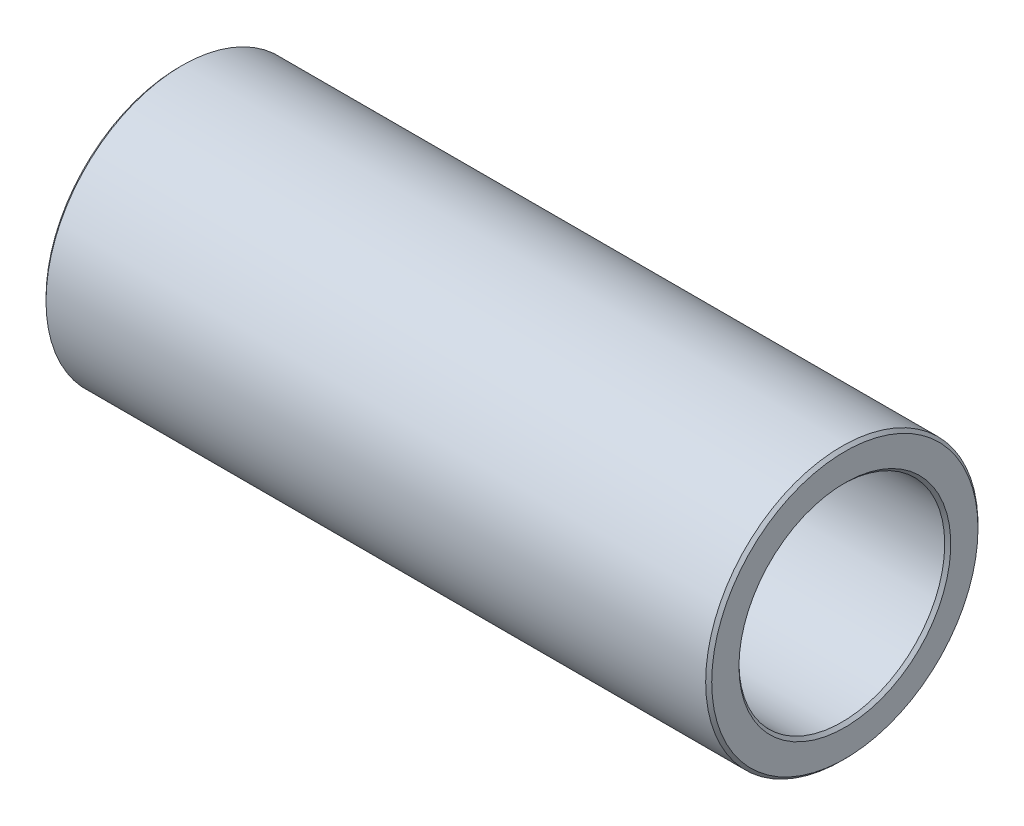
ISO-10303-21;
HEADER;
FILE_DESCRIPTION(('STEP AP214'),'2;1');
FILE_NAME('part.step','',(''),(''),'','','');
FILE_SCHEMA(('AUTOMOTIVE_DESIGN { 1 0 10303 214 1 1 1 1 }'));
ENDSEC;
DATA;
#1=APPLICATION_CONTEXT('core data for automotive mechanical design processes');
#2=APPLICATION_PROTOCOL_DEFINITION('international standard','automotive_design',2000,#1);
#3=PRODUCT_CONTEXT('',#1,'mechanical');
#4=PRODUCT('Part','Part','',(#3));
#5=PRODUCT_RELATED_PRODUCT_CATEGORY('part','',(#4));
#6=PRODUCT_DEFINITION_FORMATION('','',#4);
#7=PRODUCT_DEFINITION_CONTEXT('part definition',#1,'design');
#8=PRODUCT_DEFINITION('design','',#6,#7);
#9=PRODUCT_DEFINITION_SHAPE('','',#8);
#10=(LENGTH_UNIT() NAMED_UNIT(*) SI_UNIT(.MILLI.,.METRE.));
#11=(NAMED_UNIT(*) PLANE_ANGLE_UNIT() SI_UNIT($,.RADIAN.));
#12=(NAMED_UNIT(*) SI_UNIT($,.STERADIAN.) SOLID_ANGLE_UNIT());
#13=UNCERTAINTY_MEASURE_WITH_UNIT(LENGTH_MEASURE(1.E-05),#10,'distance_accuracy_value','');
#14=(GEOMETRIC_REPRESENTATION_CONTEXT(3) GLOBAL_UNCERTAINTY_ASSIGNED_CONTEXT((#13)) GLOBAL_UNIT_ASSIGNED_CONTEXT((#10,
#11,#12)) REPRESENTATION_CONTEXT('',''));
#15=CARTESIAN_POINT('',(0.,0.,0.));
#16=DIRECTION('',(0.,0.,1.));
#17=DIRECTION('',(1.,0.,0.));
#18=AXIS2_PLACEMENT_3D('',#15,#16,#17);
#19=CARTESIAN_POINT('',(0.,8.99999999999999,0.));
#20=DIRECTION('',(1.,0.,0.));
#21=DIRECTION('',(0.,0.,-1.));
#22=AXIS2_PLACEMENT_3D('',#19,#20,#21);
#23=PLANE('',#22);
#24=CARTESIAN_POINT('',(0.,0.,0.));
#25=DIRECTION('',(1.,0.,0.));
#26=DIRECTION('',(0.,0.,-1.));
#27=AXIS2_PLACEMENT_3D('',#24,#25,#26);
#28=CIRCLE('',#27,9.50000000000002);
#29=CARTESIAN_POINT('',(0.,0.,-9.50000000000002));
#30=VERTEX_POINT('',#29);
#31=EDGE_CURVE('E80',#30,#30,#28,.T.);
#32=ORIENTED_EDGE('',*,*,#31,.T.);
#33=EDGE_LOOP('',(#32));
#34=FACE_BOUND('',#33,.T.);
#35=CARTESIAN_POINT('',(0.,0.,0.));
#36=DIRECTION('',(1.,0.,0.));
#37=DIRECTION('',(0.,0.,-1.));
#38=AXIS2_PLACEMENT_3D('',#35,#36,#37);
#39=CIRCLE('',#38,22.);
#40=CARTESIAN_POINT('',(0.,0.,-22.));
#41=VERTEX_POINT('',#40);
#42=EDGE_CURVE('E84',#41,#41,#39,.F.);
#43=ORIENTED_EDGE('',*,*,#42,.T.);
#44=EDGE_LOOP('',(#43));
#45=FACE_BOUND('',#44,.T.);
#46=ADVANCED_FACE('F43',(#34,#45),#23,.F.);
#47=CARTESIAN_POINT('',(0.,0.,0.));
#48=DIRECTION('',(-1.,0.,0.));
#49=DIRECTION('',(0.,0.,1.));
#50=AXIS2_PLACEMENT_3D('',#47,#48,#49);
#51=CYLINDRICAL_SURFACE('',#50,22.5);
#52=CARTESIAN_POINT('',(0.500000000000035,0.,0.));
#53=DIRECTION('',(1.,0.,0.));
#54=DIRECTION('',(0.,0.,-1.));
#55=AXIS2_PLACEMENT_3D('',#52,#53,#54);
#56=CIRCLE('',#55,22.5);
#57=CARTESIAN_POINT('',(0.500000000000035,0.,-22.5));
#58=VERTEX_POINT('',#57);
#59=EDGE_CURVE('E72',#58,#58,#56,.T.);
#60=ORIENTED_EDGE('',*,*,#59,.T.);
#61=EDGE_LOOP('',(#60));
#62=FACE_BOUND('',#61,.T.);
#63=CARTESIAN_POINT('',(109.5,0.,0.));
#64=DIRECTION('',(-1.,0.,0.));
#65=DIRECTION('',(0.,0.,1.));
#66=AXIS2_PLACEMENT_3D('',#63,#64,#65);
#67=CIRCLE('',#66,22.5);
#68=CARTESIAN_POINT('',(109.5,0.,22.5));
#69=VERTEX_POINT('',#68);
#70=EDGE_CURVE('E76',#69,#69,#67,.T.);
#71=ORIENTED_EDGE('',*,*,#70,.T.);
#72=EDGE_LOOP('',(#71));
#73=FACE_BOUND('',#72,.T.);
#74=ADVANCED_FACE('F123',(#62,#73),#51,.T.);
#75=CARTESIAN_POINT('',(110.,22.5,0.));
#76=DIRECTION('',(-1.,0.,0.));
#77=DIRECTION('',(0.,0.,1.));
#78=AXIS2_PLACEMENT_3D('',#75,#76,#77);
#79=PLANE('',#78);
#80=CARTESIAN_POINT('',(110.,0.,0.));
#81=DIRECTION('',(-1.,0.,0.));
#82=DIRECTION('',(0.,0.,1.));
#83=AXIS2_PLACEMENT_3D('',#80,#81,#82);
#84=CIRCLE('',#83,17.5);
#85=CARTESIAN_POINT('',(110.,0.,17.5));
#86=VERTEX_POINT('',#85);
#87=EDGE_CURVE('E10',#86,#86,#84,.T.);
#88=ORIENTED_EDGE('',*,*,#87,.T.);
#89=EDGE_LOOP('',(#88));
#90=FACE_BOUND('',#89,.T.);
#91=CARTESIAN_POINT('',(110.,0.,0.));
#92=DIRECTION('',(-1.,0.,0.));
#93=DIRECTION('',(0.,0.,1.));
#94=AXIS2_PLACEMENT_3D('',#91,#92,#93);
#95=CIRCLE('',#94,22.);
#96=CARTESIAN_POINT('',(110.,0.,22.));
#97=VERTEX_POINT('',#96);
#98=EDGE_CURVE('E52',#97,#97,#95,.F.);
#99=ORIENTED_EDGE('',*,*,#98,.T.);
#100=EDGE_LOOP('',(#99));
#101=FACE_BOUND('',#100,.T.);
#102=ADVANCED_FACE('F129',(#90,#101),#79,.F.);
#103=CARTESIAN_POINT('',(0.,0.,0.));
#104=DIRECTION('',(-1.,0.,0.));
#105=DIRECTION('',(0.,0.,1.));
#106=AXIS2_PLACEMENT_3D('',#103,#104,#105);
#107=CYLINDRICAL_SURFACE('',#106,17.);
#108=CARTESIAN_POINT('',(64.5,0.,0.));
#109=DIRECTION('',(-1.,0.,0.));
#110=DIRECTION('',(0.,0.,1.));
#111=AXIS2_PLACEMENT_3D('',#108,#109,#110);
#112=CIRCLE('',#111,17.);
#113=CARTESIAN_POINT('',(64.5,0.,17.));
#114=VERTEX_POINT('',#113);
#115=EDGE_CURVE('E62',#114,#114,#112,.T.);
#116=ORIENTED_EDGE('',*,*,#115,.T.);
#117=EDGE_LOOP('',(#116));
#118=FACE_BOUND('',#117,.T.);
#119=CARTESIAN_POINT('',(109.5,0.,0.));
#120=DIRECTION('',(-1.,0.,0.));
#121=DIRECTION('',(0.,0.,1.));
#122=AXIS2_PLACEMENT_3D('',#119,#120,#121);
#123=CIRCLE('',#122,17.);
#124=CARTESIAN_POINT('',(109.5,0.,17.));
#125=VERTEX_POINT('',#124);
#126=EDGE_CURVE('E68',#125,#125,#123,.F.);
#127=ORIENTED_EDGE('',*,*,#126,.T.);
#128=EDGE_LOOP('',(#127));
#129=FACE_BOUND('',#128,.T.);
#130=ADVANCED_FACE('F163',(#118,#129),#107,.F.);
#131=CARTESIAN_POINT('',(64.,17.,0.));
#132=DIRECTION('',(-1.,0.,0.));
#133=DIRECTION('',(0.,0.,1.));
#134=AXIS2_PLACEMENT_3D('',#131,#132,#133);
#135=PLANE('',#134);
#136=CARTESIAN_POINT('',(64.,0.,0.));
#137=DIRECTION('',(-1.,0.,0.));
#138=DIRECTION('',(0.,0.,1.));
#139=AXIS2_PLACEMENT_3D('',#136,#137,#138);
#140=CIRCLE('',#139,16.5);
#141=CARTESIAN_POINT('',(64.,0.,16.5));
#142=VERTEX_POINT('',#141);
#143=EDGE_CURVE('E57',#142,#142,#140,.F.);
#144=ORIENTED_EDGE('',*,*,#143,.T.);
#145=EDGE_LOOP('',(#144));
#146=FACE_BOUND('',#145,.T.);
#147=CARTESIAN_POINT('',(64.,0.,0.));
#148=DIRECTION('',(-1.,0.,0.));
#149=DIRECTION('',(0.,0.,1.));
#150=AXIS2_PLACEMENT_3D('',#147,#148,#149);
#151=CIRCLE('',#150,12.);
#152=CARTESIAN_POINT('',(64.,0.,12.));
#153=VERTEX_POINT('',#152);
#154=EDGE_CURVE('E92',#153,#153,#151,.T.);
#155=ORIENTED_EDGE('',*,*,#154,.T.);
#156=EDGE_LOOP('',(#155));
#157=FACE_BOUND('',#156,.T.);
#158=ADVANCED_FACE('F165',(#146,#157),#135,.F.);
#159=CARTESIAN_POINT('',(0.,0.,0.));
#160=DIRECTION('',(-1.,0.,0.));
#161=DIRECTION('',(0.,0.,1.));
#162=AXIS2_PLACEMENT_3D('',#159,#160,#161);
#163=CYLINDRICAL_SURFACE('',#162,12.);
#164=ORIENTED_EDGE('',*,*,#154,.F.);
#165=EDGE_LOOP('',(#164));
#166=FACE_BOUND('',#165,.T.);
#167=CARTESIAN_POINT('',(4.,0.,0.));
#168=DIRECTION('',(-1.,0.,0.));
#169=DIRECTION('',(0.,0.,1.));
#170=AXIS2_PLACEMENT_3D('',#167,#168,#169);
#171=CIRCLE('',#170,12.);
#172=CARTESIAN_POINT('',(4.,0.,12.));
#173=VERTEX_POINT('',#172);
#174=EDGE_CURVE('E96',#173,#173,#171,.T.);
#175=ORIENTED_EDGE('',*,*,#174,.T.);
#176=EDGE_LOOP('',(#175));
#177=FACE_BOUND('',#176,.T.);
#178=ADVANCED_FACE('F119',(#166,#177),#163,.F.);
#179=CARTESIAN_POINT('',(4.,12.,0.));
#180=DIRECTION('',(-1.,0.,0.));
#181=DIRECTION('',(0.,0.,1.));
#182=AXIS2_PLACEMENT_3D('',#179,#180,#181);
#183=PLANE('',#182);
#184=ORIENTED_EDGE('',*,*,#174,.F.);
#185=EDGE_LOOP('',(#184));
#186=FACE_BOUND('',#185,.T.);
#187=CARTESIAN_POINT('',(4.,0.,0.));
#188=DIRECTION('',(-1.,0.,0.));
#189=DIRECTION('',(0.,0.,1.));
#190=AXIS2_PLACEMENT_3D('',#187,#188,#189);
#191=CIRCLE('',#190,9.);
#192=CARTESIAN_POINT('',(4.,0.,9.));
#193=VERTEX_POINT('',#192);
#194=EDGE_CURVE('E100',#193,#193,#191,.T.);
#195=ORIENTED_EDGE('',*,*,#194,.T.);
#196=EDGE_LOOP('',(#195));
#197=FACE_BOUND('',#196,.T.);
#198=ADVANCED_FACE('F105',(#186,#197),#183,.F.);
#199=CARTESIAN_POINT('',(0.,0.,0.));
#200=DIRECTION('',(-1.,0.,0.));
#201=DIRECTION('',(0.,0.,1.));
#202=AXIS2_PLACEMENT_3D('',#199,#200,#201);
#203=CYLINDRICAL_SURFACE('',#202,9.);
#204=CARTESIAN_POINT('',(0.500000000000014,0.,0.));
#205=DIRECTION('',(1.,0.,0.));
#206=DIRECTION('',(0.,0.,-1.));
#207=AXIS2_PLACEMENT_3D('',#204,#205,#206);
#208=CIRCLE('',#207,9.);
#209=CARTESIAN_POINT('',(0.500000000000014,0.,-9.));
#210=VERTEX_POINT('',#209);
#211=EDGE_CURVE('E88',#210,#210,#208,.F.);
#212=ORIENTED_EDGE('',*,*,#211,.T.);
#213=EDGE_LOOP('',(#212));
#214=FACE_BOUND('',#213,.T.);
#215=ORIENTED_EDGE('',*,*,#194,.F.);
#216=EDGE_LOOP('',(#215));
#217=FACE_BOUND('',#216,.T.);
#218=ADVANCED_FACE('F107',(#214,#217),#203,.F.);
#219=CARTESIAN_POINT('',(0.500000000000014,0.,0.));
#220=DIRECTION('',(-1.,0.,0.));
#221=DIRECTION('',(0.,0.,1.));
#222=AXIS2_PLACEMENT_3D('',#219,#220,#221);
#223=CONICAL_SURFACE('',#222,9.,0.785398163397459);
#224=ORIENTED_EDGE('',*,*,#31,.F.);
#225=EDGE_LOOP('',(#224));
#226=FACE_BOUND('',#225,.T.);
#227=ORIENTED_EDGE('',*,*,#211,.F.);
#228=EDGE_LOOP('',(#227));
#229=FACE_BOUND('',#228,.T.);
#230=ADVANCED_FACE('F109',(#226,#229),#223,.F.);
#231=CARTESIAN_POINT('',(0.,0.,0.));
#232=DIRECTION('',(1.,0.,0.));
#233=DIRECTION('',(0.,0.,-1.));
#234=AXIS2_PLACEMENT_3D('',#231,#232,#233);
#235=CONICAL_SURFACE('',#234,22.,0.785398163397448);
#236=ORIENTED_EDGE('',*,*,#59,.F.);
#237=EDGE_LOOP('',(#236));
#238=FACE_BOUND('',#237,.T.);
#239=ORIENTED_EDGE('',*,*,#42,.F.);
#240=EDGE_LOOP('',(#239));
#241=FACE_BOUND('',#240,.T.);
#242=ADVANCED_FACE('F116',(#238,#241),#235,.T.);
#243=CARTESIAN_POINT('',(64.5,0.,0.));
#244=DIRECTION('',(1.,0.,0.));
#245=DIRECTION('',(0.,0.,-1.));
#246=AXIS2_PLACEMENT_3D('',#243,#244,#245);
#247=CONICAL_SURFACE('',#246,17.,0.785398163397445);
#248=ORIENTED_EDGE('',*,*,#143,.F.);
#249=EDGE_LOOP('',(#248));
#250=FACE_BOUND('',#249,.T.);
#251=ORIENTED_EDGE('',*,*,#115,.F.);
#252=EDGE_LOOP('',(#251));
#253=FACE_BOUND('',#252,.T.);
#254=ADVANCED_FACE('F144',(#250,#253),#247,.F.);
#255=CARTESIAN_POINT('',(110.,0.,0.));
#256=DIRECTION('',(1.,0.,0.));
#257=DIRECTION('',(0.,0.,-1.));
#258=AXIS2_PLACEMENT_3D('',#255,#256,#257);
#259=CONICAL_SURFACE('',#258,17.5,0.785398163397452);
#260=ORIENTED_EDGE('',*,*,#126,.F.);
#261=EDGE_LOOP('',(#260));
#262=FACE_BOUND('',#261,.T.);
#263=ORIENTED_EDGE('',*,*,#87,.F.);
#264=EDGE_LOOP('',(#263));
#265=FACE_BOUND('',#264,.T.);
#266=ADVANCED_FACE('F150',(#262,#265),#259,.F.);
#267=CARTESIAN_POINT('',(109.5,0.,0.));
#268=DIRECTION('',(-1.,0.,0.));
#269=DIRECTION('',(0.,0.,1.));
#270=AXIS2_PLACEMENT_3D('',#267,#268,#269);
#271=CONICAL_SURFACE('',#270,22.5,0.785398163397428);
#272=ORIENTED_EDGE('',*,*,#98,.F.);
#273=EDGE_LOOP('',(#272));
#274=FACE_BOUND('',#273,.T.);
#275=ORIENTED_EDGE('',*,*,#70,.F.);
#276=EDGE_LOOP('',(#275));
#277=FACE_BOUND('',#276,.T.);
#278=ADVANCED_FACE('F46',(#274,#277),#271,.T.);
#279=CLOSED_SHELL('',(#46,#74,#102,#130,#158,#178,#198,#218,#230,#242,#254,#266,#278));
#280=MANIFOLD_SOLID_BREP('B2',#279);
#281=ADVANCED_BREP_SHAPE_REPRESENTATION('',(#18,#280),#14);
#282=SHAPE_DEFINITION_REPRESENTATION(#9,#281);
ENDSEC;
END-ISO-10303-21;
